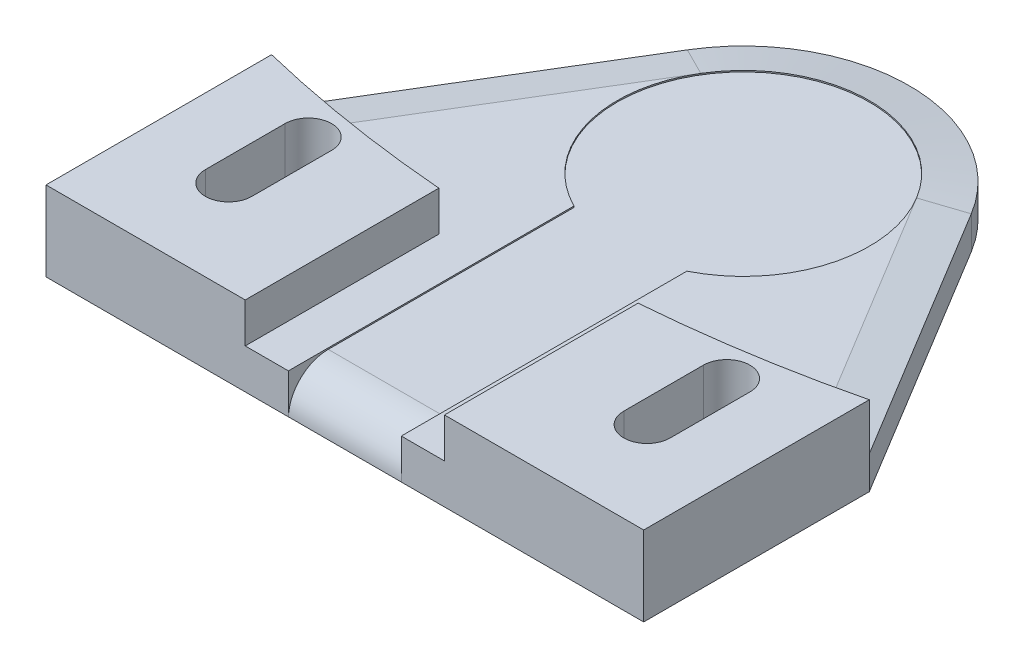
ISO-10303-21;
HEADER;
FILE_DESCRIPTION(('STEP AP214'),'2;1');
FILE_NAME('part.step','',(''),(''),'','','');
FILE_SCHEMA(('AUTOMOTIVE_DESIGN { 1 0 10303 214 1 1 1 1 }'));
ENDSEC;
DATA;
#1=APPLICATION_CONTEXT('core data for automotive mechanical design processes');
#2=APPLICATION_PROTOCOL_DEFINITION('international standard','automotive_design',2000,#1);
#3=PRODUCT_CONTEXT('',#1,'mechanical');
#4=PRODUCT('Part','Part','',(#3));
#5=PRODUCT_RELATED_PRODUCT_CATEGORY('part','',(#4));
#6=PRODUCT_DEFINITION_FORMATION('','',#4);
#7=PRODUCT_DEFINITION_CONTEXT('part definition',#1,'design');
#8=PRODUCT_DEFINITION('design','',#6,#7);
#9=PRODUCT_DEFINITION_SHAPE('','',#8);
#10=(LENGTH_UNIT() NAMED_UNIT(*) SI_UNIT(.MILLI.,.METRE.));
#11=(NAMED_UNIT(*) PLANE_ANGLE_UNIT() SI_UNIT($,.RADIAN.));
#12=(NAMED_UNIT(*) SI_UNIT($,.STERADIAN.) SOLID_ANGLE_UNIT());
#13=UNCERTAINTY_MEASURE_WITH_UNIT(LENGTH_MEASURE(1.E-05),#10,'distance_accuracy_value','');
#14=(GEOMETRIC_REPRESENTATION_CONTEXT(3) GLOBAL_UNCERTAINTY_ASSIGNED_CONTEXT((#13)) GLOBAL_UNIT_ASSIGNED_CONTEXT((#10,
#11,#12)) REPRESENTATION_CONTEXT('',''));
#15=CARTESIAN_POINT('',(0.,0.,0.));
#16=DIRECTION('',(0.,0.,1.));
#17=DIRECTION('',(1.,0.,0.));
#18=AXIS2_PLACEMENT_3D('',#15,#16,#17);
#19=CARTESIAN_POINT('',(-5.96744875736022E-13,3.,137.846096908265));
#20=DIRECTION('',(0.,1.,0.));
#21=DIRECTION('',(0.,0.,1.));
#22=AXIS2_PLACEMENT_3D('',#19,#20,#21);
#23=PLANE('',#22);
#24=CARTESIAN_POINT('',(2.9345090359137E-13,3.,58.5640646055102));
#25=DIRECTION('',(0.,1.,0.));
#26=DIRECTION('',(0.,0.,1.));
#27=AXIS2_PLACEMENT_3D('',#24,#25,#26);
#28=CIRCLE('',#27,95.);
#29=CARTESIAN_POINT('',(19.415158462999,3.,151.558965658507));
#30=VERTEX_POINT('',#29);
#31=CARTESIAN_POINT('',(7.5,3.,153.267549229889));
#32=VERTEX_POINT('',#31);
#33=EDGE_CURVE('E299',#30,#32,#28,.F.);
#34=ORIENTED_EDGE('',*,*,#33,.F.);
#35=DIRECTION('',(-0.518160336529657,0.,-0.855283500160896));
#36=VECTOR('',#35,1.);
#37=CARTESIAN_POINT('',(8.12519325152876,3.,132.923573711234));
#38=LINE('',#37,#36);
#39=CARTESIAN_POINT('',(8.12519325152868,3.,132.923573711234));
#40=VERTEX_POINT('',#39);
#41=EDGE_CURVE('E405',#30,#40,#38,.T.);
#42=ORIENTED_EDGE('',*,*,#41,.T.);
#43=CARTESIAN_POINT('',(-5.96744875736022E-13,3.,137.846096908265));
#44=DIRECTION('',(0.,1.,0.));
#45=DIRECTION('',(0.,0.,1.));
#46=AXIS2_PLACEMENT_3D('',#43,#44,#45);
#47=CIRCLE('',#46,9.50000000000027);
#48=CARTESIAN_POINT('',(4.25,3.,146.342419642249));
#49=VERTEX_POINT('',#48);
#50=EDGE_CURVE('E247',#49,#40,#47,.T.);
#51=ORIENTED_EDGE('',*,*,#50,.F.);
#52=DIRECTION('',(0.,0.,-1.));
#53=VECTOR('',#52,1.);
#54=CARTESIAN_POINT('',(4.25,3.,167.846096908266));
#55=LINE('',#54,#53);
#56=CARTESIAN_POINT('',(4.25,3.,167.846096908266));
#57=VERTEX_POINT('',#56);
#58=EDGE_CURVE('E240',#57,#49,#55,.T.);
#59=ORIENTED_EDGE('',*,*,#58,.F.);
#60=DIRECTION('',(1.,0.,0.));
#61=VECTOR('',#60,1.);
#62=CARTESIAN_POINT('',(-7.5,3.,167.846096908266));
#63=LINE('',#62,#61);
#64=CARTESIAN_POINT('',(7.5,3.,167.846096908266));
#65=VERTEX_POINT('',#64);
#66=EDGE_CURVE('E261',#57,#65,#63,.T.);
#67=ORIENTED_EDGE('',*,*,#66,.T.);
#68=DIRECTION('',(0.,0.,-1.));
#69=VECTOR('',#68,1.);
#70=CARTESIAN_POINT('',(7.5,3.,167.846096908266));
#71=LINE('',#70,#69);
#72=EDGE_CURVE('E266',#65,#32,#71,.T.);
#73=ORIENTED_EDGE('',*,*,#72,.T.);
#74=EDGE_LOOP('',(#34,#42,#51,#59,#67,#73));
#75=FACE_BOUND('',#74,.T.);
#76=ADVANCED_FACE('F33',(#75),#23,.T.);
#77=CARTESIAN_POINT('',(-22.4999999999997,6.,167.846096908266));
#78=DIRECTION('',(0.,0.,-1.));
#79=DIRECTION('',(-1.,0.,0.));
#80=AXIS2_PLACEMENT_3D('',#77,#78,#79);
#81=PLANE('',#80);
#82=DIRECTION('',(0.,1.,0.));
#83=VECTOR('',#82,1.);
#84=CARTESIAN_POINT('',(4.25,2.9,167.846096908266));
#85=LINE('',#84,#83);
#86=CARTESIAN_POINT('',(4.24999999999999,0.,167.846096908266));
#87=VERTEX_POINT('',#86);
#88=EDGE_CURVE('E254',#87,#57,#85,.T.);
#89=ORIENTED_EDGE('',*,*,#88,.F.);
#90=DIRECTION('',(1.,0.,0.));
#91=VECTOR('',#90,1.);
#92=CARTESIAN_POINT('',(-22.4999999999997,0.,167.846096908266));
#93=LINE('',#92,#91);
#94=CARTESIAN_POINT('',(22.5000000000003,0.,167.846096908266));
#95=VERTEX_POINT('',#94);
#96=EDGE_CURVE('E359',#87,#95,#93,.T.);
#97=ORIENTED_EDGE('',*,*,#96,.T.);
#98=DIRECTION('',(0.,-1.,0.));
#99=VECTOR('',#98,1.);
#100=CARTESIAN_POINT('',(22.5000000000003,6.,167.846096908266));
#101=LINE('',#100,#99);
#102=CARTESIAN_POINT('',(22.5000000000003,6.,167.846096908266));
#103=VERTEX_POINT('',#102);
#104=EDGE_CURVE('E386',#103,#95,#101,.T.);
#105=ORIENTED_EDGE('',*,*,#104,.F.);
#106=DIRECTION('',(1.,0.,0.));
#107=VECTOR('',#106,1.);
#108=CARTESIAN_POINT('',(-22.4999999999997,6.,167.846096908266));
#109=LINE('',#108,#107);
#110=CARTESIAN_POINT('',(7.5,6.,167.846096908266));
#111=VERTEX_POINT('',#110);
#112=EDGE_CURVE('E364',#111,#103,#109,.T.);
#113=ORIENTED_EDGE('',*,*,#112,.F.);
#114=DIRECTION('',(0.,1.,0.));
#115=VECTOR('',#114,1.);
#116=CARTESIAN_POINT('',(7.5,3.,167.846096908266));
#117=LINE('',#116,#115);
#118=EDGE_CURVE('E278',#65,#111,#117,.T.);
#119=ORIENTED_EDGE('',*,*,#118,.F.);
#120=ORIENTED_EDGE('',*,*,#66,.F.);
#121=EDGE_LOOP('',(#89,#97,#105,#113,#119,#120));
#122=FACE_BOUND('',#121,.T.);
#123=ADVANCED_FACE('F491',(#122),#81,.F.);
#124=CARTESIAN_POINT('',(2.9345090359137E-13,6.,58.5640646055102));
#125=DIRECTION('',(0.,1.,0.));
#126=DIRECTION('',(0.,0.,1.));
#127=AXIS2_PLACEMENT_3D('',#124,#125,#126);
#128=PLANE('',#127);
#129=DIRECTION('',(0.,0.,1.));
#130=VECTOR('',#129,1.);
#131=CARTESIAN_POINT('',(-7.5,6.,167.846096908266));
#132=LINE('',#131,#130);
#133=CARTESIAN_POINT('',(-7.5,6.,153.267549229889));
#134=VERTEX_POINT('',#133);
#135=CARTESIAN_POINT('',(-7.5,6.,167.846096908266));
#136=VERTEX_POINT('',#135);
#137=EDGE_CURVE('E253',#134,#136,#132,.T.);
#138=ORIENTED_EDGE('',*,*,#137,.F.);
#139=CARTESIAN_POINT('',(2.9345090359137E-13,6.,58.5640646055102));
#140=DIRECTION('',(0.,-1.,0.));
#141=DIRECTION('',(0.,0.,1.));
#142=AXIS2_PLACEMENT_3D('',#139,#140,#141);
#143=CIRCLE('',#142,95.);
#144=CARTESIAN_POINT('',(-22.4999999999997,6.,150.861139315384));
#145=VERTEX_POINT('',#144);
#146=EDGE_CURVE('E366',#134,#145,#143,.T.);
#147=ORIENTED_EDGE('',*,*,#146,.T.);
#148=DIRECTION('',(0.,0.,1.));
#149=VECTOR('',#148,1.);
#150=CARTESIAN_POINT('',(-22.4999999999997,6.,167.846096908266));
#151=LINE('',#150,#149);
#152=CARTESIAN_POINT('',(-22.4999999999997,6.,167.846096908266));
#153=VERTEX_POINT('',#152);
#154=EDGE_CURVE('E370',#145,#153,#151,.T.);
#155=ORIENTED_EDGE('',*,*,#154,.T.);
#156=EDGE_CURVE('E360',#153,#136,#109,.T.);
#157=ORIENTED_EDGE('',*,*,#156,.T.);
#158=EDGE_LOOP('',(#138,#147,#155,#157));
#159=FACE_BOUND('',#158,.T.);
#160=DIRECTION('',(0.,0.,-1.));
#161=VECTOR('',#160,1.);
#162=CARTESIAN_POINT('',(-13.9999999999997,6.,154.846096908266));
#163=LINE('',#162,#161);
#164=CARTESIAN_POINT('',(-13.9999999999997,6.,160.846096908266));
#165=VERTEX_POINT('',#164);
#166=CARTESIAN_POINT('',(-13.9999999999997,6.,154.846096908266));
#167=VERTEX_POINT('',#166);
#168=EDGE_CURVE('E333',#165,#167,#163,.T.);
#169=ORIENTED_EDGE('',*,*,#168,.F.);
#170=CARTESIAN_POINT('',(-15.7499999999997,6.,160.846096908266));
#171=DIRECTION('',(0.,1.,0.));
#172=DIRECTION('',(0.,0.,1.));
#173=AXIS2_PLACEMENT_3D('',#170,#171,#172);
#174=CIRCLE('',#173,1.75);
#175=CARTESIAN_POINT('',(-17.4999999999997,6.,160.846096908266));
#176=VERTEX_POINT('',#175);
#177=EDGE_CURVE('E331',#176,#165,#174,.T.);
#178=ORIENTED_EDGE('',*,*,#177,.F.);
#179=DIRECTION('',(0.,0.,1.));
#180=VECTOR('',#179,1.);
#181=CARTESIAN_POINT('',(-17.4999999999997,6.,154.846096908266));
#182=LINE('',#181,#180);
#183=CARTESIAN_POINT('',(-17.4999999999997,6.,154.846096908266));
#184=VERTEX_POINT('',#183);
#185=EDGE_CURVE('E339',#184,#176,#182,.T.);
#186=ORIENTED_EDGE('',*,*,#185,.F.);
#187=CARTESIAN_POINT('',(-15.7499999999997,6.,154.846096908266));
#188=DIRECTION('',(0.,1.,0.));
#189=DIRECTION('',(0.,0.,1.));
#190=AXIS2_PLACEMENT_3D('',#187,#188,#189);
#191=CIRCLE('',#190,1.75);
#192=EDGE_CURVE('E336',#167,#184,#191,.T.);
#193=ORIENTED_EDGE('',*,*,#192,.F.);
#194=EDGE_LOOP('',(#169,#178,#186,#193));
#195=FACE_BOUND('',#194,.T.);
#196=ADVANCED_FACE('F440',(#159,#195),#128,.T.);
#197=CARTESIAN_POINT('',(2.9345090359137E-13,6.,58.5640646055102));
#198=DIRECTION('',(0.,-1.,0.));
#199=DIRECTION('',(0.,0.,-1.));
#200=AXIS2_PLACEMENT_3D('',#197,#198,#199);
#201=CYLINDRICAL_SURFACE('',#200,95.);
#202=ORIENTED_EDGE('',*,*,#146,.F.);
#203=DIRECTION('',(0.,1.,0.));
#204=VECTOR('',#203,1.);
#205=CARTESIAN_POINT('',(-7.5,3.,153.267549229889));
#206=LINE('',#205,#204);
#207=CARTESIAN_POINT('',(-7.5,3.,153.267549229889));
#208=VERTEX_POINT('',#207);
#209=EDGE_CURVE('E272',#208,#134,#206,.T.);
#210=ORIENTED_EDGE('',*,*,#209,.F.);
#211=CARTESIAN_POINT('',(-19.4151584629985,3.,151.558965658507));
#212=VERTEX_POINT('',#211);
#213=EDGE_CURVE('E298',#208,#212,#28,.F.);
#214=ORIENTED_EDGE('',*,*,#213,.T.);
#215=CARTESIAN_POINT('',(2.9345090359137E-13,-2.56854791266206,58.5640646055102));
#216=DIRECTION('',(-0.148518421191531,0.984807753012208,-0.0899775981776571));
#217=DIRECTION('',(-0.842289821981869,-0.173648177666928,-0.510288316717821));
#218=AXIS2_PLACEMENT_3D('',#215,#216,#217);
#219=ELLIPSE('',#218,96.4655281291457,95.);
#220=CARTESIAN_POINT('',(-22.4999999999997,2.4710190578746,150.861139315384));
#221=VERTEX_POINT('',#220);
#222=EDGE_CURVE('E11',#212,#221,#219,.F.);
#223=ORIENTED_EDGE('',*,*,#222,.T.);
#224=DIRECTION('',(0.,-1.,0.));
#225=VECTOR('',#224,1.);
#226=CARTESIAN_POINT('',(-22.4999999999997,6.,150.861139315384));
#227=LINE('',#226,#225);
#228=EDGE_CURVE('E58',#145,#221,#227,.T.);
#229=ORIENTED_EDGE('',*,*,#228,.F.);
#230=EDGE_LOOP('',(#202,#210,#214,#223,#229));
#231=FACE_BOUND('',#230,.T.);
#232=ADVANCED_FACE('F435',(#231),#201,.F.);
#233=DIRECTION('',(0.,0.,-1.));
#234=VECTOR('',#233,1.);
#235=CARTESIAN_POINT('',(7.5,6.,167.846096908266));
#236=LINE('',#235,#234);
#237=CARTESIAN_POINT('',(7.5,6.,153.267549229889));
#238=VERTEX_POINT('',#237);
#239=EDGE_CURVE('E262',#111,#238,#236,.T.);
#240=ORIENTED_EDGE('',*,*,#239,.F.);
#241=ORIENTED_EDGE('',*,*,#112,.T.);
#242=DIRECTION('',(0.,0.,-1.));
#243=VECTOR('',#242,1.);
#244=CARTESIAN_POINT('',(22.5000000000003,6.,167.846096908266));
#245=LINE('',#244,#243);
#246=CARTESIAN_POINT('',(22.5000000000003,6.,150.861139315384));
#247=VERTEX_POINT('',#246);
#248=EDGE_CURVE('E363',#103,#247,#245,.T.);
#249=ORIENTED_EDGE('',*,*,#248,.T.);
#250=EDGE_CURVE('E367',#247,#238,#143,.T.);
#251=ORIENTED_EDGE('',*,*,#250,.T.);
#252=EDGE_LOOP('',(#240,#241,#249,#251));
#253=FACE_BOUND('',#252,.T.);
#254=DIRECTION('',(0.,0.,1.));
#255=VECTOR('',#254,1.);
#256=CARTESIAN_POINT('',(14.0000000000003,6.,154.846096908266));
#257=LINE('',#256,#255);
#258=CARTESIAN_POINT('',(14.0000000000003,6.,154.846096908266));
#259=VERTEX_POINT('',#258);
#260=CARTESIAN_POINT('',(14.0000000000003,6.,160.846096908266));
#261=VERTEX_POINT('',#260);
#262=EDGE_CURVE('E304',#259,#261,#257,.T.);
#263=ORIENTED_EDGE('',*,*,#262,.F.);
#264=CARTESIAN_POINT('',(15.7500000000003,6.,154.846096908266));
#265=DIRECTION('',(0.,1.,0.));
#266=DIRECTION('',(0.,0.,-1.));
#267=AXIS2_PLACEMENT_3D('',#264,#265,#266);
#268=CIRCLE('',#267,1.75);
#269=CARTESIAN_POINT('',(17.5000000000003,6.,154.846096908266));
#270=VERTEX_POINT('',#269);
#271=EDGE_CURVE('E302',#270,#259,#268,.T.);
#272=ORIENTED_EDGE('',*,*,#271,.F.);
#273=DIRECTION('',(0.,0.,-1.));
#274=VECTOR('',#273,1.);
#275=CARTESIAN_POINT('',(17.5000000000003,6.,154.846096908266));
#276=LINE('',#275,#274);
#277=CARTESIAN_POINT('',(17.5000000000003,6.,160.846096908266));
#278=VERTEX_POINT('',#277);
#279=EDGE_CURVE('E310',#278,#270,#276,.T.);
#280=ORIENTED_EDGE('',*,*,#279,.F.);
#281=CARTESIAN_POINT('',(15.7500000000003,6.,160.846096908266));
#282=DIRECTION('',(0.,1.,0.));
#283=DIRECTION('',(0.,0.,-1.));
#284=AXIS2_PLACEMENT_3D('',#281,#282,#283);
#285=CIRCLE('',#284,1.75);
#286=EDGE_CURVE('E307',#261,#278,#285,.T.);
#287=ORIENTED_EDGE('',*,*,#286,.F.);
#288=EDGE_LOOP('',(#263,#272,#280,#287));
#289=FACE_BOUND('',#288,.T.);
#290=ADVANCED_FACE('F546',(#253,#289),#128,.T.);
#291=CARTESIAN_POINT('',(2.9345090359137E-13,0.,58.5640646055102));
#292=DIRECTION('',(0.,1.,0.));
#293=DIRECTION('',(0.,0.,1.));
#294=AXIS2_PLACEMENT_3D('',#291,#292,#293);
#295=PLANE('',#294);
#296=ORIENTED_EDGE('',*,*,#96,.F.);
#297=DIRECTION('',(0.,0.,-1.));
#298=VECTOR('',#297,1.);
#299=CARTESIAN_POINT('',(4.25000000000002,0.,58.5640646055102));
#300=LINE('',#299,#298);
#301=CARTESIAN_POINT('',(4.25,0.,167.844429778379));
#302=VERTEX_POINT('',#301);
#303=EDGE_CURVE('E397',#87,#302,#300,.T.);
#304=ORIENTED_EDGE('',*,*,#303,.T.);
#305=DIRECTION('',(-1.,0.,0.));
#306=VECTOR('',#305,1.);
#307=CARTESIAN_POINT('',(0.,0.,167.844429778379));
#308=LINE('',#307,#306);
#309=CARTESIAN_POINT('',(-4.25,0.,167.844429778379));
#310=VERTEX_POINT('',#309);
#311=EDGE_CURVE('E391',#302,#310,#308,.T.);
#312=ORIENTED_EDGE('',*,*,#311,.T.);
#313=DIRECTION('',(0.,0.,1.));
#314=VECTOR('',#313,1.);
#315=CARTESIAN_POINT('',(-4.25000000000002,0.,58.5640646055102));
#316=LINE('',#315,#314);
#317=CARTESIAN_POINT('',(-4.25000000000001,0.,167.846096908266));
#318=VERTEX_POINT('',#317);
#319=EDGE_CURVE('E394',#310,#318,#316,.T.);
#320=ORIENTED_EDGE('',*,*,#319,.T.);
#321=CARTESIAN_POINT('',(-22.4999999999997,0.,167.846096908266));
#322=VERTEX_POINT('',#321);
#323=EDGE_CURVE('E373',#322,#318,#93,.T.);
#324=ORIENTED_EDGE('',*,*,#323,.F.);
#325=DIRECTION('',(0.,0.,1.));
#326=VECTOR('',#325,1.);
#327=CARTESIAN_POINT('',(-22.4999999999997,0.,167.846096908266));
#328=LINE('',#327,#326);
#329=CARTESIAN_POINT('',(-22.4999999999997,0.,150.861139315384));
#330=VERTEX_POINT('',#329);
#331=EDGE_CURVE('E379',#330,#322,#328,.T.);
#332=ORIENTED_EDGE('',*,*,#331,.F.);
#333=DIRECTION('',(-0.518160336529656,0.,0.855283500160896));
#334=VECTOR('',#333,1.);
#335=CARTESIAN_POINT('',(-22.4999999999997,0.,150.861139315384));
#336=LINE('',#335,#334);
#337=CARTESIAN_POINT('',(-10.6910437520116,0.,131.369092701645));
#338=VERTEX_POINT('',#337);
#339=EDGE_CURVE('E287',#338,#330,#336,.T.);
#340=ORIENTED_EDGE('',*,*,#339,.F.);
#341=CARTESIAN_POINT('',(-5.96744875736022E-13,0.,137.846096908265));
#342=DIRECTION('',(0.,1.,0.));
#343=DIRECTION('',(0.,0.,1.));
#344=AXIS2_PLACEMENT_3D('',#341,#342,#343);
#345=CIRCLE('',#344,12.4999999999997);
#346=CARTESIAN_POINT('',(10.6910437520115,0.,131.369092701645));
#347=VERTEX_POINT('',#346);
#348=EDGE_CURVE('E284',#347,#338,#345,.T.);
#349=ORIENTED_EDGE('',*,*,#348,.F.);
#350=DIRECTION('',(-0.518160336529657,0.,-0.855283500160896));
#351=VECTOR('',#350,1.);
#352=CARTESIAN_POINT('',(22.5000000000003,0.,150.861139315384));
#353=LINE('',#352,#351);
#354=CARTESIAN_POINT('',(22.5000000000003,0.,150.861139315384));
#355=VERTEX_POINT('',#354);
#356=EDGE_CURVE('E274',#355,#347,#353,.T.);
#357=ORIENTED_EDGE('',*,*,#356,.F.);
#358=DIRECTION('',(0.,0.,-1.));
#359=VECTOR('',#358,1.);
#360=CARTESIAN_POINT('',(22.5000000000003,0.,167.846096908266));
#361=LINE('',#360,#359);
#362=EDGE_CURVE('E376',#95,#355,#361,.T.);
#363=ORIENTED_EDGE('',*,*,#362,.F.);
#364=EDGE_LOOP('',(#296,#304,#312,#320,#324,#332,#340,#349,#357,#363));
#365=FACE_BOUND('',#364,.T.);
#366=CARTESIAN_POINT('',(-15.7499999999997,0.,160.846096908266));
#367=DIRECTION('',(0.,1.,0.));
#368=DIRECTION('',(0.,0.,1.));
#369=AXIS2_PLACEMENT_3D('',#366,#367,#368);
#370=CIRCLE('',#369,1.75);
#371=CARTESIAN_POINT('',(-17.4999999999997,0.,160.846096908266));
#372=VERTEX_POINT('',#371);
#373=CARTESIAN_POINT('',(-13.9999999999997,0.,160.846096908266));
#374=VERTEX_POINT('',#373);
#375=EDGE_CURVE('E330',#372,#374,#370,.T.);
#376=ORIENTED_EDGE('',*,*,#375,.T.);
#377=DIRECTION('',(0.,0.,-1.));
#378=VECTOR('',#377,1.);
#379=CARTESIAN_POINT('',(-13.9999999999997,0.,154.846096908266));
#380=LINE('',#379,#378);
#381=CARTESIAN_POINT('',(-13.9999999999997,0.,154.846096908266));
#382=VERTEX_POINT('',#381);
#383=EDGE_CURVE('E344',#374,#382,#380,.T.);
#384=ORIENTED_EDGE('',*,*,#383,.T.);
#385=CARTESIAN_POINT('',(-15.7499999999997,0.,154.846096908266));
#386=DIRECTION('',(0.,1.,0.));
#387=DIRECTION('',(0.,0.,1.));
#388=AXIS2_PLACEMENT_3D('',#385,#386,#387);
#389=CIRCLE('',#388,1.75);
#390=CARTESIAN_POINT('',(-17.4999999999997,0.,154.846096908266));
#391=VERTEX_POINT('',#390);
#392=EDGE_CURVE('E347',#382,#391,#389,.T.);
#393=ORIENTED_EDGE('',*,*,#392,.T.);
#394=DIRECTION('',(0.,0.,1.));
#395=VECTOR('',#394,1.);
#396=CARTESIAN_POINT('',(-17.4999999999997,0.,154.846096908266));
#397=LINE('',#396,#395);
#398=EDGE_CURVE('E334',#391,#372,#397,.T.);
#399=ORIENTED_EDGE('',*,*,#398,.T.);
#400=EDGE_LOOP('',(#376,#384,#393,#399));
#401=FACE_BOUND('',#400,.T.);
#402=CARTESIAN_POINT('',(15.7500000000003,0.,154.846096908266));
#403=DIRECTION('',(0.,1.,0.));
#404=DIRECTION('',(0.,0.,-1.));
#405=AXIS2_PLACEMENT_3D('',#402,#403,#404);
#406=CIRCLE('',#405,1.75);
#407=CARTESIAN_POINT('',(17.5000000000003,0.,154.846096908266));
#408=VERTEX_POINT('',#407);
#409=CARTESIAN_POINT('',(14.0000000000003,0.,154.846096908266));
#410=VERTEX_POINT('',#409);
#411=EDGE_CURVE('E301',#408,#410,#406,.T.);
#412=ORIENTED_EDGE('',*,*,#411,.T.);
#413=DIRECTION('',(0.,0.,1.));
#414=VECTOR('',#413,1.);
#415=CARTESIAN_POINT('',(14.0000000000003,0.,154.846096908266));
#416=LINE('',#415,#414);
#417=CARTESIAN_POINT('',(14.0000000000003,0.,160.846096908266));
#418=VERTEX_POINT('',#417);
#419=EDGE_CURVE('E315',#410,#418,#416,.T.);
#420=ORIENTED_EDGE('',*,*,#419,.T.);
#421=CARTESIAN_POINT('',(15.7500000000003,0.,160.846096908266));
#422=DIRECTION('',(0.,1.,0.));
#423=DIRECTION('',(0.,0.,-1.));
#424=AXIS2_PLACEMENT_3D('',#421,#422,#423);
#425=CIRCLE('',#424,1.75);
#426=CARTESIAN_POINT('',(17.5000000000003,0.,160.846096908266));
#427=VERTEX_POINT('',#426);
#428=EDGE_CURVE('E318',#418,#427,#425,.T.);
#429=ORIENTED_EDGE('',*,*,#428,.T.);
#430=DIRECTION('',(0.,0.,-1.));
#431=VECTOR('',#430,1.);
#432=CARTESIAN_POINT('',(17.5000000000003,0.,154.846096908266));
#433=LINE('',#432,#431);
#434=EDGE_CURVE('E305',#427,#408,#433,.T.);
#435=ORIENTED_EDGE('',*,*,#434,.T.);
#436=EDGE_LOOP('',(#412,#420,#429,#435));
#437=FACE_BOUND('',#436,.T.);
#438=ADVANCED_FACE('F451',(#365,#401,#437),#295,.F.);
#439=ORIENTED_EDGE('',*,*,#323,.T.);
#440=DIRECTION('',(0.,1.,0.));
#441=VECTOR('',#440,1.);
#442=CARTESIAN_POINT('',(-4.25,2.9,167.846096908266));
#443=LINE('',#442,#441);
#444=CARTESIAN_POINT('',(-4.25,3.,167.846096908266));
#445=VERTEX_POINT('',#444);
#446=EDGE_CURVE('E225',#318,#445,#443,.T.);
#447=ORIENTED_EDGE('',*,*,#446,.T.);
#448=CARTESIAN_POINT('',(-7.5,3.,167.846096908266));
#449=VERTEX_POINT('',#448);
#450=EDGE_CURVE('E263',#449,#445,#63,.T.);
#451=ORIENTED_EDGE('',*,*,#450,.F.);
#452=DIRECTION('',(0.,1.,0.));
#453=VECTOR('',#452,1.);
#454=CARTESIAN_POINT('',(-7.5,3.,167.846096908266));
#455=LINE('',#454,#453);
#456=EDGE_CURVE('E269',#449,#136,#455,.T.);
#457=ORIENTED_EDGE('',*,*,#456,.T.);
#458=ORIENTED_EDGE('',*,*,#156,.F.);
#459=DIRECTION('',(0.,-1.,0.));
#460=VECTOR('',#459,1.);
#461=CARTESIAN_POINT('',(-22.4999999999997,6.,167.846096908266));
#462=LINE('',#461,#460);
#463=EDGE_CURVE('E372',#153,#322,#462,.T.);
#464=ORIENTED_EDGE('',*,*,#463,.T.);
#465=EDGE_LOOP('',(#439,#447,#451,#457,#458,#464));
#466=FACE_BOUND('',#465,.T.);
#467=ADVANCED_FACE('F445',(#466),#81,.F.);
#468=CARTESIAN_POINT('',(22.5000000000003,6.,167.846096908266));
#469=DIRECTION('',(-1.,0.,0.));
#470=DIRECTION('',(0.,0.,1.));
#471=AXIS2_PLACEMENT_3D('',#468,#469,#470);
#472=PLANE('',#471);
#473=ORIENTED_EDGE('',*,*,#104,.T.);
#474=ORIENTED_EDGE('',*,*,#362,.T.);
#475=DIRECTION('',(0.,-1.,0.));
#476=VECTOR('',#475,1.);
#477=CARTESIAN_POINT('',(22.5000000000003,3.,150.861139315384));
#478=LINE('',#477,#476);
#479=CARTESIAN_POINT('',(22.5000000000003,2.4710190578746,150.861139315384));
#480=VERTEX_POINT('',#479);
#481=EDGE_CURVE('E296',#480,#355,#478,.T.);
#482=ORIENTED_EDGE('',*,*,#481,.F.);
#483=DIRECTION('',(0.,-1.,0.));
#484=VECTOR('',#483,1.);
#485=CARTESIAN_POINT('',(22.5000000000003,6.,150.861139315384));
#486=LINE('',#485,#484);
#487=EDGE_CURVE('E384',#247,#480,#486,.T.);
#488=ORIENTED_EDGE('',*,*,#487,.F.);
#489=ORIENTED_EDGE('',*,*,#248,.F.);
#490=EDGE_LOOP('',(#473,#474,#482,#488,#489));
#491=FACE_BOUND('',#490,.T.);
#492=ADVANCED_FACE('F477',(#491),#472,.F.);
#493=ORIENTED_EDGE('',*,*,#487,.T.);
#494=CARTESIAN_POINT('',(2.9345090359137E-13,-2.56854791266206,58.5640646055102));
#495=DIRECTION('',(0.148518421191531,0.984807753012208,-0.0899775981776571));
#496=DIRECTION('',(0.842289821981869,-0.173648177666928,-0.510288316717821));
#497=AXIS2_PLACEMENT_3D('',#494,#495,#496);
#498=ELLIPSE('',#497,96.4655281291457,95.);
#499=EDGE_CURVE('E42',#480,#30,#498,.F.);
#500=ORIENTED_EDGE('',*,*,#499,.T.);
#501=ORIENTED_EDGE('',*,*,#33,.T.);
#502=DIRECTION('',(0.,1.,0.));
#503=VECTOR('',#502,1.);
#504=CARTESIAN_POINT('',(7.5,3.,153.267549229889));
#505=LINE('',#504,#503);
#506=EDGE_CURVE('E275',#32,#238,#505,.T.);
#507=ORIENTED_EDGE('',*,*,#506,.T.);
#508=ORIENTED_EDGE('',*,*,#250,.F.);
#509=EDGE_LOOP('',(#493,#500,#501,#507,#508));
#510=FACE_BOUND('',#509,.T.);
#511=ADVANCED_FACE('F467',(#510),#201,.F.);
#512=CARTESIAN_POINT('',(-22.4999999999997,6.,167.846096908266));
#513=DIRECTION('',(1.,0.,0.));
#514=DIRECTION('',(0.,0.,-1.));
#515=AXIS2_PLACEMENT_3D('',#512,#513,#514);
#516=PLANE('',#515);
#517=ORIENTED_EDGE('',*,*,#228,.T.);
#518=DIRECTION('',(0.,-1.,0.));
#519=VECTOR('',#518,1.);
#520=CARTESIAN_POINT('',(-22.4999999999997,3.,150.861139315384));
#521=LINE('',#520,#519);
#522=EDGE_CURVE('E290',#221,#330,#521,.T.);
#523=ORIENTED_EDGE('',*,*,#522,.T.);
#524=ORIENTED_EDGE('',*,*,#331,.T.);
#525=ORIENTED_EDGE('',*,*,#463,.F.);
#526=ORIENTED_EDGE('',*,*,#154,.F.);
#527=EDGE_LOOP('',(#517,#523,#524,#525,#526));
#528=FACE_BOUND('',#527,.T.);
#529=ADVANCED_FACE('F544',(#528),#516,.F.);
#530=CARTESIAN_POINT('',(-15.7499999999997,6.,160.846096908266));
#531=DIRECTION('',(0.,-1.,0.));
#532=DIRECTION('',(0.,0.,-1.));
#533=AXIS2_PLACEMENT_3D('',#530,#531,#532);
#534=CYLINDRICAL_SURFACE('',#533,1.75);
#535=DIRECTION('',(0.,-1.,0.));
#536=VECTOR('',#535,1.);
#537=CARTESIAN_POINT('',(-13.9999999999997,6.,160.846096908266));
#538=LINE('',#537,#536);
#539=EDGE_CURVE('E357',#165,#374,#538,.T.);
#540=ORIENTED_EDGE('',*,*,#539,.T.);
#541=ORIENTED_EDGE('',*,*,#375,.F.);
#542=DIRECTION('',(0.,-1.,0.));
#543=VECTOR('',#542,1.);
#544=CARTESIAN_POINT('',(-17.4999999999997,6.,160.846096908266));
#545=LINE('',#544,#543);
#546=EDGE_CURVE('E341',#176,#372,#545,.T.);
#547=ORIENTED_EDGE('',*,*,#546,.F.);
#548=ORIENTED_EDGE('',*,*,#177,.T.);
#549=EDGE_LOOP('',(#540,#541,#547,#548));
#550=FACE_BOUND('',#549,.T.);
#551=ADVANCED_FACE('F540',(#550),#534,.F.);
#552=CARTESIAN_POINT('',(-13.9999999999997,6.,154.846096908266));
#553=DIRECTION('',(-1.,0.,0.));
#554=DIRECTION('',(0.,0.,1.));
#555=AXIS2_PLACEMENT_3D('',#552,#553,#554);
#556=PLANE('',#555);
#557=DIRECTION('',(0.,-1.,0.));
#558=VECTOR('',#557,1.);
#559=CARTESIAN_POINT('',(-13.9999999999997,6.,154.846096908266));
#560=LINE('',#559,#558);
#561=EDGE_CURVE('E355',#167,#382,#560,.T.);
#562=ORIENTED_EDGE('',*,*,#561,.T.);
#563=ORIENTED_EDGE('',*,*,#383,.F.);
#564=ORIENTED_EDGE('',*,*,#539,.F.);
#565=ORIENTED_EDGE('',*,*,#168,.T.);
#566=EDGE_LOOP('',(#562,#563,#564,#565));
#567=FACE_BOUND('',#566,.T.);
#568=ADVANCED_FACE('F536',(#567),#556,.T.);
#569=CARTESIAN_POINT('',(-15.7499999999997,6.,154.846096908266));
#570=DIRECTION('',(0.,-1.,0.));
#571=DIRECTION('',(0.,0.,-1.));
#572=AXIS2_PLACEMENT_3D('',#569,#570,#571);
#573=CYLINDRICAL_SURFACE('',#572,1.75);
#574=DIRECTION('',(0.,-1.,0.));
#575=VECTOR('',#574,1.);
#576=CARTESIAN_POINT('',(-17.4999999999997,6.,154.846096908266));
#577=LINE('',#576,#575);
#578=EDGE_CURVE('E353',#184,#391,#577,.T.);
#579=ORIENTED_EDGE('',*,*,#578,.T.);
#580=ORIENTED_EDGE('',*,*,#392,.F.);
#581=ORIENTED_EDGE('',*,*,#561,.F.);
#582=ORIENTED_EDGE('',*,*,#192,.T.);
#583=EDGE_LOOP('',(#579,#580,#581,#582));
#584=FACE_BOUND('',#583,.T.);
#585=ADVANCED_FACE('F532',(#584),#573,.F.);
#586=CARTESIAN_POINT('',(-17.4999999999997,6.,154.846096908266));
#587=DIRECTION('',(1.,0.,0.));
#588=DIRECTION('',(0.,0.,-1.));
#589=AXIS2_PLACEMENT_3D('',#586,#587,#588);
#590=PLANE('',#589);
#591=ORIENTED_EDGE('',*,*,#546,.T.);
#592=ORIENTED_EDGE('',*,*,#398,.F.);
#593=ORIENTED_EDGE('',*,*,#578,.F.);
#594=ORIENTED_EDGE('',*,*,#185,.T.);
#595=EDGE_LOOP('',(#591,#592,#593,#594));
#596=FACE_BOUND('',#595,.T.);
#597=ADVANCED_FACE('F528',(#596),#590,.T.);
#598=CARTESIAN_POINT('',(15.7500000000003,6.,154.846096908266));
#599=DIRECTION('',(0.,-1.,0.));
#600=DIRECTION('',(0.,0.,-1.));
#601=AXIS2_PLACEMENT_3D('',#598,#599,#600);
#602=CYLINDRICAL_SURFACE('',#601,1.75);
#603=DIRECTION('',(0.,-1.,0.));
#604=VECTOR('',#603,1.);
#605=CARTESIAN_POINT('',(14.0000000000003,6.,154.846096908266));
#606=LINE('',#605,#604);
#607=EDGE_CURVE('E328',#259,#410,#606,.T.);
#608=ORIENTED_EDGE('',*,*,#607,.T.);
#609=ORIENTED_EDGE('',*,*,#411,.F.);
#610=DIRECTION('',(0.,-1.,0.));
#611=VECTOR('',#610,1.);
#612=CARTESIAN_POINT('',(17.5000000000003,6.,154.846096908266));
#613=LINE('',#612,#611);
#614=EDGE_CURVE('E312',#270,#408,#613,.T.);
#615=ORIENTED_EDGE('',*,*,#614,.F.);
#616=ORIENTED_EDGE('',*,*,#271,.T.);
#617=EDGE_LOOP('',(#608,#609,#615,#616));
#618=FACE_BOUND('',#617,.T.);
#619=ADVANCED_FACE('F524',(#618),#602,.F.);
#620=CARTESIAN_POINT('',(14.0000000000003,6.,154.846096908266));
#621=DIRECTION('',(1.,0.,0.));
#622=DIRECTION('',(0.,0.,-1.));
#623=AXIS2_PLACEMENT_3D('',#620,#621,#622);
#624=PLANE('',#623);
#625=DIRECTION('',(0.,-1.,0.));
#626=VECTOR('',#625,1.);
#627=CARTESIAN_POINT('',(14.0000000000003,6.,160.846096908266));
#628=LINE('',#627,#626);
#629=EDGE_CURVE('E326',#261,#418,#628,.T.);
#630=ORIENTED_EDGE('',*,*,#629,.T.);
#631=ORIENTED_EDGE('',*,*,#419,.F.);
#632=ORIENTED_EDGE('',*,*,#607,.F.);
#633=ORIENTED_EDGE('',*,*,#262,.T.);
#634=EDGE_LOOP('',(#630,#631,#632,#633));
#635=FACE_BOUND('',#634,.T.);
#636=ADVANCED_FACE('F517',(#635),#624,.T.);
#637=CARTESIAN_POINT('',(15.7500000000003,6.,160.846096908266));
#638=DIRECTION('',(0.,-1.,0.));
#639=DIRECTION('',(0.,0.,-1.));
#640=AXIS2_PLACEMENT_3D('',#637,#638,#639);
#641=CYLINDRICAL_SURFACE('',#640,1.75);
#642=DIRECTION('',(0.,-1.,0.));
#643=VECTOR('',#642,1.);
#644=CARTESIAN_POINT('',(17.5000000000003,6.,160.846096908266));
#645=LINE('',#644,#643);
#646=EDGE_CURVE('E324',#278,#427,#645,.T.);
#647=ORIENTED_EDGE('',*,*,#646,.T.);
#648=ORIENTED_EDGE('',*,*,#428,.F.);
#649=ORIENTED_EDGE('',*,*,#629,.F.);
#650=ORIENTED_EDGE('',*,*,#286,.T.);
#651=EDGE_LOOP('',(#647,#648,#649,#650));
#652=FACE_BOUND('',#651,.T.);
#653=ADVANCED_FACE('F510',(#652),#641,.F.);
#654=CARTESIAN_POINT('',(17.5000000000003,6.,154.846096908266));
#655=DIRECTION('',(-1.,0.,0.));
#656=DIRECTION('',(0.,0.,1.));
#657=AXIS2_PLACEMENT_3D('',#654,#655,#656);
#658=PLANE('',#657);
#659=ORIENTED_EDGE('',*,*,#614,.T.);
#660=ORIENTED_EDGE('',*,*,#434,.F.);
#661=ORIENTED_EDGE('',*,*,#646,.F.);
#662=ORIENTED_EDGE('',*,*,#279,.T.);
#663=EDGE_LOOP('',(#659,#660,#661,#662));
#664=FACE_BOUND('',#663,.T.);
#665=ADVANCED_FACE('F503',(#664),#658,.T.);
#666=CARTESIAN_POINT('',(-8.12519325152939,3.,132.923573711233));
#667=VERTEX_POINT('',#666);
#668=CARTESIAN_POINT('',(-4.25,3.,146.342419642249));
#669=VERTEX_POINT('',#668);
#670=EDGE_CURVE('E222',#667,#669,#47,.T.);
#671=ORIENTED_EDGE('',*,*,#670,.F.);
#672=DIRECTION('',(-0.518160336529657,0.,0.855283500160896));
#673=VECTOR('',#672,1.);
#674=CARTESIAN_POINT('',(-19.934149499517,3.,152.415620324973));
#675=LINE('',#674,#673);
#676=EDGE_CURVE('E403',#667,#212,#675,.T.);
#677=ORIENTED_EDGE('',*,*,#676,.T.);
#678=ORIENTED_EDGE('',*,*,#213,.F.);
#679=DIRECTION('',(0.,0.,1.));
#680=VECTOR('',#679,1.);
#681=CARTESIAN_POINT('',(-7.5,3.,167.846096908266));
#682=LINE('',#681,#680);
#683=EDGE_CURVE('E258',#208,#449,#682,.T.);
#684=ORIENTED_EDGE('',*,*,#683,.T.);
#685=ORIENTED_EDGE('',*,*,#450,.T.);
#686=DIRECTION('',(0.,0.,1.));
#687=VECTOR('',#686,1.);
#688=CARTESIAN_POINT('',(-4.25,3.,146.342419642249));
#689=LINE('',#688,#687);
#690=EDGE_CURVE('E243',#669,#445,#689,.T.);
#691=ORIENTED_EDGE('',*,*,#690,.F.);
#692=EDGE_LOOP('',(#671,#677,#678,#684,#685,#691));
#693=FACE_BOUND('',#692,.T.);
#694=ADVANCED_FACE('F431',(#693),#23,.T.);
#695=CARTESIAN_POINT('',(22.5000000000003,3.,150.861139315384));
#696=DIRECTION('',(-0.855283500160896,0.,0.518160336529657));
#697=DIRECTION('',(0.518160336529657,0.,0.855283500160896));
#698=AXIS2_PLACEMENT_3D('',#695,#696,#697);
#699=PLANE('',#698);
#700=DIRECTION('',(0.,-1.,0.));
#701=VECTOR('',#700,1.);
#702=CARTESIAN_POINT('',(10.6910437520115,3.,131.369092701645));
#703=LINE('',#702,#701);
#704=CARTESIAN_POINT('',(10.6910437520115,2.4710190578746,131.369092701645));
#705=VERTEX_POINT('',#704);
#706=EDGE_CURVE('E294',#705,#347,#703,.T.);
#707=ORIENTED_EDGE('',*,*,#706,.F.);
#708=DIRECTION('',(0.518160336529657,0.,0.855283500160896));
#709=VECTOR('',#708,1.);
#710=CARTESIAN_POINT('',(22.5000000000003,2.4710190578746,150.861139315384));
#711=LINE('',#710,#709);
#712=EDGE_CURVE('E408',#705,#480,#711,.T.);
#713=ORIENTED_EDGE('',*,*,#712,.T.);
#714=ORIENTED_EDGE('',*,*,#481,.T.);
#715=ORIENTED_EDGE('',*,*,#356,.T.);
#716=EDGE_LOOP('',(#707,#713,#714,#715));
#717=FACE_BOUND('',#716,.T.);
#718=ADVANCED_FACE('F475',(#717),#699,.F.);
#719=CARTESIAN_POINT('',(-5.96744875736022E-13,3.,137.846096908265));
#720=DIRECTION('',(0.,-1.,0.));
#721=DIRECTION('',(0.,0.,-1.));
#722=AXIS2_PLACEMENT_3D('',#719,#720,#721);
#723=CYLINDRICAL_SURFACE('',#722,12.4999999999997);
#724=DIRECTION('',(0.,-1.,0.));
#725=VECTOR('',#724,1.);
#726=CARTESIAN_POINT('',(-10.6910437520116,3.,131.369092701645));
#727=LINE('',#726,#725);
#728=CARTESIAN_POINT('',(-10.6910437520116,2.4710190578746,131.369092701645));
#729=VERTEX_POINT('',#728);
#730=EDGE_CURVE('E292',#729,#338,#727,.T.);
#731=ORIENTED_EDGE('',*,*,#730,.F.);
#732=CARTESIAN_POINT('',(-5.96744875736022E-13,2.4710190578746,137.846096908265));
#733=DIRECTION('',(0.,1.,0.));
#734=DIRECTION('',(0.,0.,1.));
#735=AXIS2_PLACEMENT_3D('',#732,#733,#734);
#736=CIRCLE('',#735,12.4999999999997);
#737=EDGE_CURVE('E412',#729,#705,#736,.F.);
#738=ORIENTED_EDGE('',*,*,#737,.T.);
#739=ORIENTED_EDGE('',*,*,#706,.T.);
#740=ORIENTED_EDGE('',*,*,#348,.T.);
#741=EDGE_LOOP('',(#731,#738,#739,#740));
#742=FACE_BOUND('',#741,.T.);
#743=ADVANCED_FACE('F482',(#742),#723,.T.);
#744=CARTESIAN_POINT('',(-22.4999999999997,3.,150.861139315384));
#745=DIRECTION('',(0.855283500160896,0.,0.518160336529657));
#746=DIRECTION('',(0.518160336529657,0.,-0.855283500160896));
#747=AXIS2_PLACEMENT_3D('',#744,#745,#746);
#748=PLANE('',#747);
#749=ORIENTED_EDGE('',*,*,#522,.F.);
#750=DIRECTION('',(0.518160336529657,0.,-0.855283500160896));
#751=VECTOR('',#750,1.);
#752=CARTESIAN_POINT('',(-10.6910437520109,2.4710190578746,131.369092701645));
#753=LINE('',#752,#751);
#754=EDGE_CURVE('E50',#221,#729,#753,.T.);
#755=ORIENTED_EDGE('',*,*,#754,.T.);
#756=ORIENTED_EDGE('',*,*,#730,.T.);
#757=ORIENTED_EDGE('',*,*,#339,.T.);
#758=EDGE_LOOP('',(#749,#755,#756,#757));
#759=FACE_BOUND('',#758,.T.);
#760=ADVANCED_FACE('F576',(#759),#748,.F.);
#761=CARTESIAN_POINT('',(-7.5,3.,167.846096908266));
#762=DIRECTION('',(-1.,0.,0.));
#763=DIRECTION('',(0.,0.,1.));
#764=AXIS2_PLACEMENT_3D('',#761,#762,#763);
#765=PLANE('',#764);
#766=ORIENTED_EDGE('',*,*,#137,.T.);
#767=ORIENTED_EDGE('',*,*,#456,.F.);
#768=ORIENTED_EDGE('',*,*,#683,.F.);
#769=ORIENTED_EDGE('',*,*,#209,.T.);
#770=EDGE_LOOP('',(#766,#767,#768,#769));
#771=FACE_BOUND('',#770,.T.);
#772=ADVANCED_FACE('F438',(#771),#765,.F.);
#773=CARTESIAN_POINT('',(7.5,3.,167.846096908266));
#774=DIRECTION('',(1.,0.,0.));
#775=DIRECTION('',(0.,0.,-1.));
#776=AXIS2_PLACEMENT_3D('',#773,#774,#775);
#777=PLANE('',#776);
#778=ORIENTED_EDGE('',*,*,#239,.T.);
#779=ORIENTED_EDGE('',*,*,#506,.F.);
#780=ORIENTED_EDGE('',*,*,#72,.F.);
#781=ORIENTED_EDGE('',*,*,#118,.T.);
#782=EDGE_LOOP('',(#778,#779,#780,#781));
#783=FACE_BOUND('',#782,.T.);
#784=ADVANCED_FACE('F572',(#783),#777,.F.);
#785=CARTESIAN_POINT('',(-5.96744875736022E-13,2.9,137.846096908265));
#786=DIRECTION('',(0.,1.,0.));
#787=DIRECTION('',(0.,0.,1.));
#788=AXIS2_PLACEMENT_3D('',#785,#786,#787);
#789=CYLINDRICAL_SURFACE('',#788,9.50000000000027);
#790=ORIENTED_EDGE('',*,*,#50,.T.);
#791=EDGE_CURVE('E249',#40,#667,#47,.T.);
#792=ORIENTED_EDGE('',*,*,#791,.T.);
#793=ORIENTED_EDGE('',*,*,#670,.T.);
#794=DIRECTION('',(0.,1.,0.));
#795=VECTOR('',#794,1.);
#796=CARTESIAN_POINT('',(-4.25,2.9,146.342419642249));
#797=LINE('',#796,#795);
#798=CARTESIAN_POINT('',(-4.25,2.9,146.342419642249));
#799=VERTEX_POINT('',#798);
#800=EDGE_CURVE('E215',#799,#669,#797,.T.);
#801=ORIENTED_EDGE('',*,*,#800,.F.);
#802=CARTESIAN_POINT('',(-5.96744875736022E-13,2.9,137.846096908265));
#803=DIRECTION('',(0.,1.,0.));
#804=DIRECTION('',(0.,0.,1.));
#805=AXIS2_PLACEMENT_3D('',#802,#803,#804);
#806=CIRCLE('',#805,9.50000000000027);
#807=CARTESIAN_POINT('',(4.25,2.9,146.342419642249));
#808=VERTEX_POINT('',#807);
#809=EDGE_CURVE('E220',#808,#799,#806,.T.);
#810=ORIENTED_EDGE('',*,*,#809,.F.);
#811=DIRECTION('',(0.,1.,0.));
#812=VECTOR('',#811,1.);
#813=CARTESIAN_POINT('',(4.25,2.9,146.342419642249));
#814=LINE('',#813,#812);
#815=EDGE_CURVE('E251',#808,#49,#814,.T.);
#816=ORIENTED_EDGE('',*,*,#815,.T.);
#817=EDGE_LOOP('',(#790,#792,#793,#801,#810,#816));
#818=FACE_BOUND('',#817,.T.);
#819=ADVANCED_FACE('F218',(#818),#789,.F.);
#820=CARTESIAN_POINT('',(4.25,2.9,167.846096908266));
#821=DIRECTION('',(1.,0.,0.));
#822=DIRECTION('',(0.,0.,-1.));
#823=AXIS2_PLACEMENT_3D('',#820,#821,#822);
#824=PLANE('',#823);
#825=ORIENTED_EDGE('',*,*,#58,.T.);
#826=ORIENTED_EDGE('',*,*,#815,.F.);
#827=DIRECTION('',(0.,0.,-1.));
#828=VECTOR('',#827,1.);
#829=CARTESIAN_POINT('',(4.25,2.9,167.846096908266));
#830=LINE('',#829,#828);
#831=CARTESIAN_POINT('',(4.25,2.9,164.846096908266));
#832=VERTEX_POINT('',#831);
#833=EDGE_CURVE('E226',#832,#808,#830,.T.);
#834=ORIENTED_EDGE('',*,*,#833,.F.);
#835=CARTESIAN_POINT('',(4.25,-0.0999999999999998,164.846096908266));
#836=DIRECTION('',(1.,0.,0.));
#837=DIRECTION('',(0.,0.,-1.));
#838=AXIS2_PLACEMENT_3D('',#835,#836,#837);
#839=CIRCLE('',#838,3.);
#840=EDGE_CURVE('E400',#832,#302,#839,.T.);
#841=ORIENTED_EDGE('',*,*,#840,.T.);
#842=ORIENTED_EDGE('',*,*,#303,.F.);
#843=ORIENTED_EDGE('',*,*,#88,.T.);
#844=EDGE_LOOP('',(#825,#826,#834,#841,#842,#843));
#845=FACE_BOUND('',#844,.T.);
#846=ADVANCED_FACE('F459',(#845),#824,.F.);
#847=CARTESIAN_POINT('',(-4.25,2.9,146.342419642249));
#848=DIRECTION('',(-1.,0.,0.));
#849=DIRECTION('',(0.,0.,1.));
#850=AXIS2_PLACEMENT_3D('',#847,#848,#849);
#851=PLANE('',#850);
#852=ORIENTED_EDGE('',*,*,#690,.T.);
#853=ORIENTED_EDGE('',*,*,#446,.F.);
#854=ORIENTED_EDGE('',*,*,#319,.F.);
#855=CARTESIAN_POINT('',(-4.25,-0.0999999999999998,164.846096908266));
#856=DIRECTION('',(-1.,0.,0.));
#857=DIRECTION('',(0.,0.,1.));
#858=AXIS2_PLACEMENT_3D('',#855,#856,#857);
#859=CIRCLE('',#858,3.);
#860=CARTESIAN_POINT('',(-4.25,2.9,164.846096908266));
#861=VERTEX_POINT('',#860);
#862=EDGE_CURVE('E232',#310,#861,#859,.T.);
#863=ORIENTED_EDGE('',*,*,#862,.T.);
#864=DIRECTION('',(0.,0.,1.));
#865=VECTOR('',#864,1.);
#866=CARTESIAN_POINT('',(-4.25,2.9,146.342419642249));
#867=LINE('',#866,#865);
#868=EDGE_CURVE('E229',#799,#861,#867,.T.);
#869=ORIENTED_EDGE('',*,*,#868,.F.);
#870=ORIENTED_EDGE('',*,*,#800,.T.);
#871=EDGE_LOOP('',(#852,#853,#854,#863,#869,#870));
#872=FACE_BOUND('',#871,.T.);
#873=ADVANCED_FACE('F230',(#872),#851,.F.);
#874=CARTESIAN_POINT('',(-5.96744875736022E-13,2.9,137.846096908265));
#875=DIRECTION('',(0.,1.,0.));
#876=DIRECTION('',(0.,0.,1.));
#877=AXIS2_PLACEMENT_3D('',#874,#875,#876);
#878=PLANE('',#877);
#879=ORIENTED_EDGE('',*,*,#868,.T.);
#880=DIRECTION('',(1.,0.,0.));
#881=VECTOR('',#880,1.);
#882=CARTESIAN_POINT('',(4.25,2.9,164.846096908266));
#883=LINE('',#882,#881);
#884=EDGE_CURVE('E389',#861,#832,#883,.T.);
#885=ORIENTED_EDGE('',*,*,#884,.T.);
#886=ORIENTED_EDGE('',*,*,#833,.T.);
#887=ORIENTED_EDGE('',*,*,#809,.T.);
#888=EDGE_LOOP('',(#879,#885,#886,#887));
#889=FACE_BOUND('',#888,.T.);
#890=ADVANCED_FACE('F237',(#889),#878,.T.);
#891=CARTESIAN_POINT('',(-6.13398221105399E-13,-0.0999999999999998,164.846096908266));
#892=DIRECTION('',(-1.,0.,0.));
#893=DIRECTION('',(0.,0.,1.));
#894=AXIS2_PLACEMENT_3D('',#891,#892,#893);
#895=CYLINDRICAL_SURFACE('',#894,3.);
#896=ORIENTED_EDGE('',*,*,#862,.F.);
#897=ORIENTED_EDGE('',*,*,#311,.F.);
#898=ORIENTED_EDGE('',*,*,#840,.F.);
#899=ORIENTED_EDGE('',*,*,#884,.F.);
#900=EDGE_LOOP('',(#896,#897,#898,#899));
#901=FACE_BOUND('',#900,.T.);
#902=ADVANCED_FACE('F457',(#901),#895,.T.);
#903=CARTESIAN_POINT('',(-8.12519325152813,3.,132.923573711234));
#904=DIRECTION('',(-0.148518421191531,0.984807753012208,-0.0899775981776571));
#905=DIRECTION('',(0.518160336529657,0.,-0.855283500160896));
#906=AXIS2_PLACEMENT_3D('',#903,#904,#905);
#907=PLANE('',#906);
#908=ORIENTED_EDGE('',*,*,#222,.F.);
#909=ORIENTED_EDGE('',*,*,#676,.F.);
#910=DIRECTION('',(0.84228982198187,0.173648177666928,0.510288316717819));
#911=VECTOR('',#910,1.);
#912=CARTESIAN_POINT('',(-10.6910437520109,2.4710190578746,131.369092701645));
#913=LINE('',#912,#911);
#914=EDGE_CURVE('E37',#729,#667,#913,.T.);
#915=ORIENTED_EDGE('',*,*,#914,.F.);
#916=ORIENTED_EDGE('',*,*,#754,.F.);
#917=EDGE_LOOP('',(#908,#909,#915,#916));
#918=FACE_BOUND('',#917,.T.);
#919=ADVANCED_FACE('F35',(#918),#907,.T.);
#920=CARTESIAN_POINT('',(-5.96744875736022E-13,3.,137.846096908265));
#921=DIRECTION('',(0.,-1.,0.));
#922=DIRECTION('',(0.,0.,-1.));
#923=AXIS2_PLACEMENT_3D('',#920,#921,#922);
#924=CONICAL_SURFACE('',#923,9.49999999999961,1.39626340159547);
#925=ORIENTED_EDGE('',*,*,#914,.T.);
#926=ORIENTED_EDGE('',*,*,#791,.F.);
#927=DIRECTION('',(-0.84228982198187,0.173648177666928,0.510288316717818));
#928=VECTOR('',#927,1.);
#929=CARTESIAN_POINT('',(10.6910437520109,2.4710190578746,131.369092701645));
#930=LINE('',#929,#928);
#931=EDGE_CURVE('E414',#705,#40,#930,.T.);
#932=ORIENTED_EDGE('',*,*,#931,.F.);
#933=ORIENTED_EDGE('',*,*,#737,.F.);
#934=EDGE_LOOP('',(#925,#926,#932,#933));
#935=FACE_BOUND('',#934,.T.);
#936=ADVANCED_FACE('F483',(#935),#924,.T.);
#937=CARTESIAN_POINT('',(8.12519325152822,3.,132.923573711233));
#938=DIRECTION('',(0.148518421191531,0.984807753012208,-0.0899775981776571));
#939=DIRECTION('',(0.518160336529657,0.,0.855283500160896));
#940=AXIS2_PLACEMENT_3D('',#937,#938,#939);
#941=PLANE('',#940);
#942=ORIENTED_EDGE('',*,*,#499,.F.);
#943=ORIENTED_EDGE('',*,*,#712,.F.);
#944=ORIENTED_EDGE('',*,*,#931,.T.);
#945=ORIENTED_EDGE('',*,*,#41,.F.);
#946=EDGE_LOOP('',(#942,#943,#944,#945));
#947=FACE_BOUND('',#946,.T.);
#948=ADVANCED_FACE('F465',(#947),#941,.T.);
#949=CLOSED_SHELL('',(#76,#123,#196,#232,#290,#438,#467,#492,#511,#529,#551,#568,#585,#597,#619,
#636,#653,#665,#694,#718,#743,#760,#772,#784,#819,#846,#873,#890,#902,#919,#936,#948));
#950=MANIFOLD_SOLID_BREP('B2',#949);
#951=ADVANCED_BREP_SHAPE_REPRESENTATION('',(#18,#950),#14);
#952=SHAPE_DEFINITION_REPRESENTATION(#9,#951);
ENDSEC;
END-ISO-10303-21;
